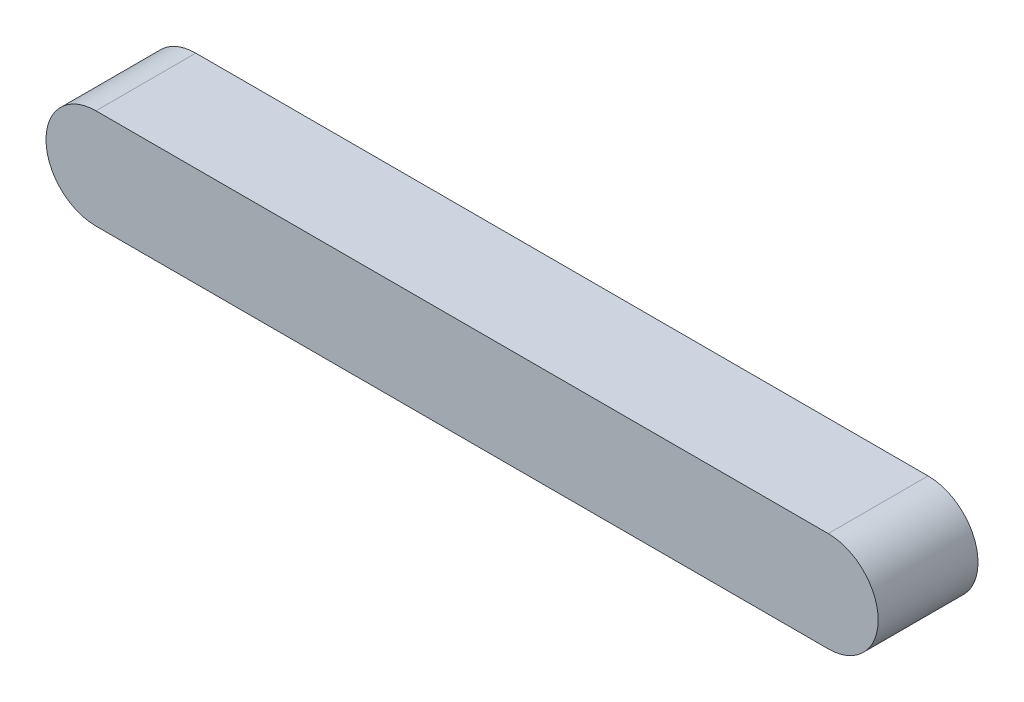
ISO-10303-21;
HEADER;
FILE_DESCRIPTION(('STEP AP214'),'2;1');
FILE_NAME('part.step','',(''),(''),'','','');
FILE_SCHEMA(('AUTOMOTIVE_DESIGN { 1 0 10303 214 1 1 1 1 }'));
ENDSEC;
DATA;
#1=APPLICATION_CONTEXT('core data for automotive mechanical design processes');
#2=APPLICATION_PROTOCOL_DEFINITION('international standard','automotive_design',2000,#1);
#3=PRODUCT_CONTEXT('',#1,'mechanical');
#4=PRODUCT('Part','Part','',(#3));
#5=PRODUCT_RELATED_PRODUCT_CATEGORY('part','',(#4));
#6=PRODUCT_DEFINITION_FORMATION('','',#4);
#7=PRODUCT_DEFINITION_CONTEXT('part definition',#1,'design');
#8=PRODUCT_DEFINITION('design','',#6,#7);
#9=PRODUCT_DEFINITION_SHAPE('','',#8);
#10=(LENGTH_UNIT() NAMED_UNIT(*) SI_UNIT(.MILLI.,.METRE.));
#11=(NAMED_UNIT(*) PLANE_ANGLE_UNIT() SI_UNIT($,.RADIAN.));
#12=(NAMED_UNIT(*) SI_UNIT($,.STERADIAN.) SOLID_ANGLE_UNIT());
#13=UNCERTAINTY_MEASURE_WITH_UNIT(LENGTH_MEASURE(1.E-05),#10,'distance_accuracy_value','');
#14=(GEOMETRIC_REPRESENTATION_CONTEXT(3) GLOBAL_UNCERTAINTY_ASSIGNED_CONTEXT((#13)) GLOBAL_UNIT_ASSIGNED_CONTEXT((#10,
#11,#12)) REPRESENTATION_CONTEXT('',''));
#15=CARTESIAN_POINT('',(0.,0.,0.));
#16=DIRECTION('',(0.,0.,1.));
#17=DIRECTION('',(1.,0.,0.));
#18=AXIS2_PLACEMENT_3D('',#15,#16,#17);
#19=CARTESIAN_POINT('',(-44.,0.,12.));
#20=DIRECTION('',(0.,0.,-1.));
#21=DIRECTION('',(-1.,0.,0.));
#22=AXIS2_PLACEMENT_3D('',#19,#20,#21);
#23=CYLINDRICAL_SURFACE('',#22,5.99999999999997);
#24=CARTESIAN_POINT('',(-44.,0.,0.));
#25=DIRECTION('',(0.,0.,1.));
#26=DIRECTION('',(1.,0.,0.));
#27=AXIS2_PLACEMENT_3D('',#24,#25,#26);
#28=CIRCLE('',#27,5.99999999999997);
#29=CARTESIAN_POINT('',(-44.,5.99999999999997,0.));
#30=VERTEX_POINT('',#29);
#31=CARTESIAN_POINT('',(-44.,-5.99999999999997,0.));
#32=VERTEX_POINT('',#31);
#33=EDGE_CURVE('E100',#30,#32,#28,.T.);
#34=ORIENTED_EDGE('',*,*,#33,.T.);
#35=DIRECTION('',(0.,0.,-1.));
#36=VECTOR('',#35,1.);
#37=CARTESIAN_POINT('',(-44.,-5.99999999999997,12.));
#38=LINE('',#37,#36);
#39=CARTESIAN_POINT('',(-44.,-5.99999999999997,12.));
#40=VERTEX_POINT('',#39);
#41=EDGE_CURVE('E11',#40,#32,#38,.T.);
#42=ORIENTED_EDGE('',*,*,#41,.F.);
#43=CARTESIAN_POINT('',(-44.,0.,12.));
#44=DIRECTION('',(0.,0.,1.));
#45=DIRECTION('',(1.,0.,0.));
#46=AXIS2_PLACEMENT_3D('',#43,#44,#45);
#47=CIRCLE('',#46,5.99999999999997);
#48=CARTESIAN_POINT('',(-44.,5.99999999999997,12.));
#49=VERTEX_POINT('',#48);
#50=EDGE_CURVE('E88',#49,#40,#47,.T.);
#51=ORIENTED_EDGE('',*,*,#50,.F.);
#52=DIRECTION('',(0.,0.,-1.));
#53=VECTOR('',#52,1.);
#54=CARTESIAN_POINT('',(-44.,5.99999999999997,12.));
#55=LINE('',#54,#53);
#56=EDGE_CURVE('E96',#49,#30,#55,.T.);
#57=ORIENTED_EDGE('',*,*,#56,.T.);
#58=EDGE_LOOP('',(#34,#42,#51,#57));
#59=FACE_BOUND('',#58,.T.);
#60=ADVANCED_FACE('F37',(#59),#23,.T.);
#61=CARTESIAN_POINT('',(-44.,-5.99999999999997,12.));
#62=DIRECTION('',(0.,1.,0.));
#63=DIRECTION('',(-1.,0.,0.));
#64=AXIS2_PLACEMENT_3D('',#61,#62,#63);
#65=PLANE('',#64);
#66=DIRECTION('',(1.,0.,0.));
#67=VECTOR('',#66,1.);
#68=CARTESIAN_POINT('',(-44.,-5.99999999999997,0.));
#69=LINE('',#68,#67);
#70=CARTESIAN_POINT('',(44.,-5.99999999999997,0.));
#71=VERTEX_POINT('',#70);
#72=EDGE_CURVE('E92',#32,#71,#69,.T.);
#73=ORIENTED_EDGE('',*,*,#72,.T.);
#74=DIRECTION('',(0.,0.,-1.));
#75=VECTOR('',#74,1.);
#76=CARTESIAN_POINT('',(44.,-5.99999999999997,12.));
#77=LINE('',#76,#75);
#78=CARTESIAN_POINT('',(44.,-5.99999999999997,12.));
#79=VERTEX_POINT('',#78);
#80=EDGE_CURVE('E45',#79,#71,#77,.T.);
#81=ORIENTED_EDGE('',*,*,#80,.F.);
#82=DIRECTION('',(1.,0.,0.));
#83=VECTOR('',#82,1.);
#84=CARTESIAN_POINT('',(-44.,-5.99999999999997,12.));
#85=LINE('',#84,#83);
#86=EDGE_CURVE('E83',#40,#79,#85,.T.);
#87=ORIENTED_EDGE('',*,*,#86,.F.);
#88=ORIENTED_EDGE('',*,*,#41,.T.);
#89=EDGE_LOOP('',(#73,#81,#87,#88));
#90=FACE_BOUND('',#89,.T.);
#91=ADVANCED_FACE('F91',(#90),#65,.F.);
#92=CARTESIAN_POINT('',(44.,0.,12.));
#93=DIRECTION('',(0.,0.,-1.));
#94=DIRECTION('',(-1.,0.,0.));
#95=AXIS2_PLACEMENT_3D('',#92,#93,#94);
#96=CYLINDRICAL_SURFACE('',#95,5.99999999999997);
#97=CARTESIAN_POINT('',(44.,0.,0.));
#98=DIRECTION('',(0.,0.,1.));
#99=DIRECTION('',(1.,0.,0.));
#100=AXIS2_PLACEMENT_3D('',#97,#98,#99);
#101=CIRCLE('',#100,5.99999999999997);
#102=CARTESIAN_POINT('',(44.,5.99999999999998,0.));
#103=VERTEX_POINT('',#102);
#104=EDGE_CURVE('E70',#71,#103,#101,.T.);
#105=ORIENTED_EDGE('',*,*,#104,.T.);
#106=DIRECTION('',(0.,0.,-1.));
#107=VECTOR('',#106,1.);
#108=CARTESIAN_POINT('',(44.,5.99999999999998,12.));
#109=LINE('',#108,#107);
#110=CARTESIAN_POINT('',(44.,5.99999999999998,12.));
#111=VERTEX_POINT('',#110);
#112=EDGE_CURVE('E93',#111,#103,#109,.T.);
#113=ORIENTED_EDGE('',*,*,#112,.F.);
#114=CARTESIAN_POINT('',(44.,0.,12.));
#115=DIRECTION('',(0.,0.,1.));
#116=DIRECTION('',(1.,0.,0.));
#117=AXIS2_PLACEMENT_3D('',#114,#115,#116);
#118=CIRCLE('',#117,5.99999999999997);
#119=EDGE_CURVE('E86',#79,#111,#118,.T.);
#120=ORIENTED_EDGE('',*,*,#119,.F.);
#121=ORIENTED_EDGE('',*,*,#80,.T.);
#122=EDGE_LOOP('',(#105,#113,#120,#121));
#123=FACE_BOUND('',#122,.T.);
#124=ADVANCED_FACE('F94',(#123),#96,.T.);
#125=CARTESIAN_POINT('',(-44.,5.99999999999997,12.));
#126=DIRECTION('',(0.,-1.,0.));
#127=DIRECTION('',(1.,0.,0.));
#128=AXIS2_PLACEMENT_3D('',#125,#126,#127);
#129=PLANE('',#128);
#130=DIRECTION('',(-1.,0.,0.));
#131=VECTOR('',#130,1.);
#132=CARTESIAN_POINT('',(-44.,5.99999999999997,0.));
#133=LINE('',#132,#131);
#134=EDGE_CURVE('E76',#103,#30,#133,.T.);
#135=ORIENTED_EDGE('',*,*,#134,.T.);
#136=ORIENTED_EDGE('',*,*,#56,.F.);
#137=DIRECTION('',(-1.,0.,0.));
#138=VECTOR('',#137,1.);
#139=CARTESIAN_POINT('',(-44.,5.99999999999997,12.));
#140=LINE('',#139,#138);
#141=EDGE_CURVE('E53',#111,#49,#140,.T.);
#142=ORIENTED_EDGE('',*,*,#141,.F.);
#143=ORIENTED_EDGE('',*,*,#112,.T.);
#144=EDGE_LOOP('',(#135,#136,#142,#143));
#145=FACE_BOUND('',#144,.T.);
#146=ADVANCED_FACE('F107',(#145),#129,.F.);
#147=CARTESIAN_POINT('',(-44.,0.,12.));
#148=DIRECTION('',(0.,0.,1.));
#149=DIRECTION('',(1.,0.,0.));
#150=AXIS2_PLACEMENT_3D('',#147,#148,#149);
#151=PLANE('',#150);
#152=ORIENTED_EDGE('',*,*,#50,.T.);
#153=ORIENTED_EDGE('',*,*,#86,.T.);
#154=ORIENTED_EDGE('',*,*,#119,.T.);
#155=ORIENTED_EDGE('',*,*,#141,.T.);
#156=EDGE_LOOP('',(#152,#153,#154,#155));
#157=FACE_BOUND('',#156,.T.);
#158=ADVANCED_FACE('F84',(#157),#151,.T.);
#159=CARTESIAN_POINT('',(-44.,0.,0.));
#160=DIRECTION('',(0.,0.,1.));
#161=DIRECTION('',(1.,0.,0.));
#162=AXIS2_PLACEMENT_3D('',#159,#160,#161);
#163=PLANE('',#162);
#164=ORIENTED_EDGE('',*,*,#33,.F.);
#165=ORIENTED_EDGE('',*,*,#134,.F.);
#166=ORIENTED_EDGE('',*,*,#104,.F.);
#167=ORIENTED_EDGE('',*,*,#72,.F.);
#168=EDGE_LOOP('',(#164,#165,#166,#167));
#169=FACE_BOUND('',#168,.T.);
#170=ADVANCED_FACE('F110',(#169),#163,.F.);
#171=CLOSED_SHELL('',(#60,#91,#124,#146,#158,#170));
#172=MANIFOLD_SOLID_BREP('B2',#171);
#173=ADVANCED_BREP_SHAPE_REPRESENTATION('',(#18,#172),#14);
#174=SHAPE_DEFINITION_REPRESENTATION(#9,#173);
ENDSEC;
END-ISO-10303-21;
